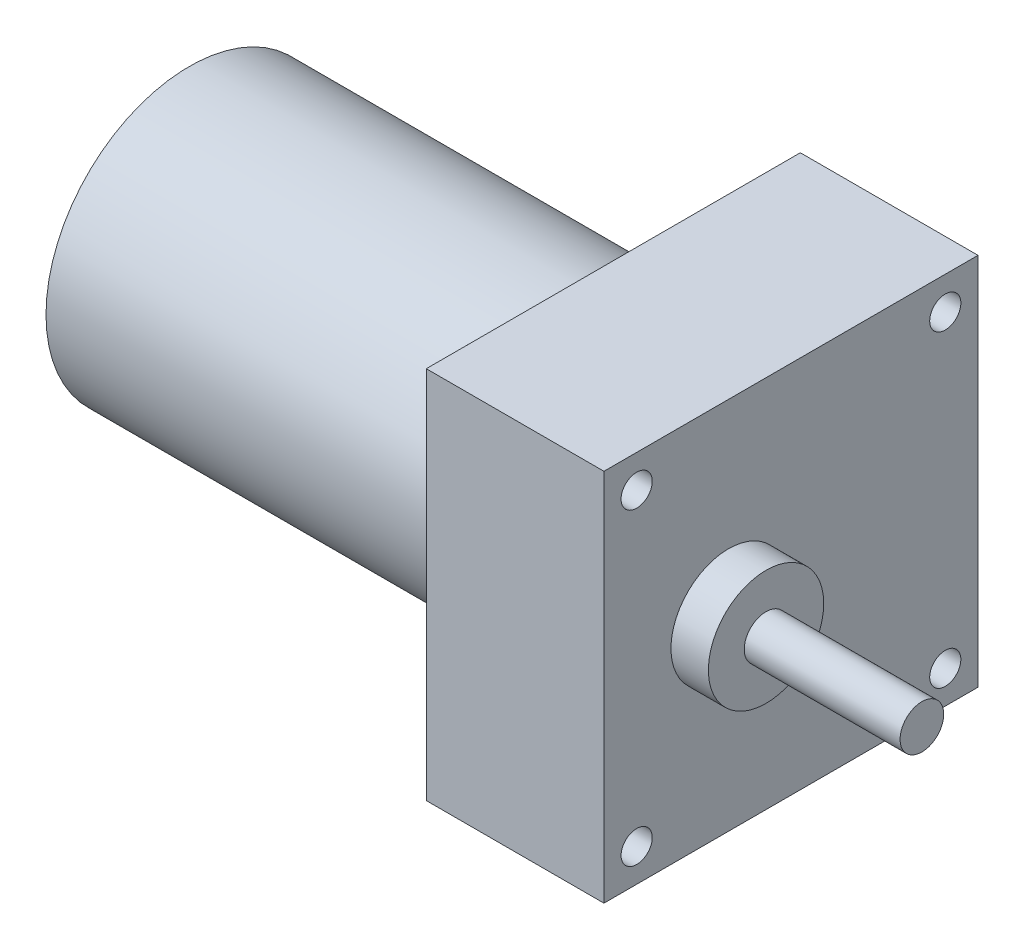
ISO-10303-21;
HEADER;
FILE_DESCRIPTION(('STEP AP214'),'2;1');
FILE_NAME('part.step','',(''),(''),'','','');
FILE_SCHEMA(('AUTOMOTIVE_DESIGN { 1 0 10303 214 1 1 1 1 }'));
ENDSEC;
DATA;
#1=APPLICATION_CONTEXT('core data for automotive mechanical design processes');
#2=APPLICATION_PROTOCOL_DEFINITION('international standard','automotive_design',2000,#1);
#3=PRODUCT_CONTEXT('',#1,'mechanical');
#4=PRODUCT('Part','Part','',(#3));
#5=PRODUCT_RELATED_PRODUCT_CATEGORY('part','',(#4));
#6=PRODUCT_DEFINITION_FORMATION('','',#4);
#7=PRODUCT_DEFINITION_CONTEXT('part definition',#1,'design');
#8=PRODUCT_DEFINITION('design','',#6,#7);
#9=PRODUCT_DEFINITION_SHAPE('','',#8);
#10=(LENGTH_UNIT() NAMED_UNIT(*) SI_UNIT(.MILLI.,.METRE.));
#11=(NAMED_UNIT(*) PLANE_ANGLE_UNIT() SI_UNIT($,.RADIAN.));
#12=(NAMED_UNIT(*) SI_UNIT($,.STERADIAN.) SOLID_ANGLE_UNIT());
#13=UNCERTAINTY_MEASURE_WITH_UNIT(LENGTH_MEASURE(1.E-05),#10,'distance_accuracy_value','');
#14=(GEOMETRIC_REPRESENTATION_CONTEXT(3) GLOBAL_UNCERTAINTY_ASSIGNED_CONTEXT((#13)) GLOBAL_UNIT_ASSIGNED_CONTEXT((#10,
#11,#12)) REPRESENTATION_CONTEXT('',''));
#15=CARTESIAN_POINT('',(0.,0.,0.));
#16=DIRECTION('',(0.,0.,1.));
#17=DIRECTION('',(1.,0.,0.));
#18=AXIS2_PLACEMENT_3D('',#15,#16,#17);
#19=CARTESIAN_POINT('',(59.5,0.,10.));
#20=DIRECTION('',(-1.,0.,0.));
#21=DIRECTION('',(0.,0.,1.));
#22=AXIS2_PLACEMENT_3D('',#19,#20,#21);
#23=CYLINDRICAL_SURFACE('',#22,3.5);
#24=CARTESIAN_POINT('',(59.5,0.,10.));
#25=DIRECTION('',(1.,0.,0.));
#26=DIRECTION('',(0.,0.,-1.));
#27=AXIS2_PLACEMENT_3D('',#24,#25,#26);
#28=CIRCLE('',#27,3.5);
#29=CARTESIAN_POINT('',(59.5,0.,6.5));
#30=VERTEX_POINT('',#29);
#31=EDGE_CURVE('E12',#30,#30,#28,.T.);
#32=ORIENTED_EDGE('',*,*,#31,.F.);
#33=EDGE_LOOP('',(#32));
#34=FACE_BOUND('',#33,.T.);
#35=CARTESIAN_POINT('',(34.5,0.,10.));
#36=DIRECTION('',(1.,0.,0.));
#37=DIRECTION('',(0.,0.,-1.));
#38=AXIS2_PLACEMENT_3D('',#35,#36,#37);
#39=CIRCLE('',#38,3.5);
#40=CARTESIAN_POINT('',(34.5,0.,6.5));
#41=VERTEX_POINT('',#40);
#42=EDGE_CURVE('E59',#41,#41,#39,.T.);
#43=ORIENTED_EDGE('',*,*,#42,.T.);
#44=EDGE_LOOP('',(#43));
#45=FACE_BOUND('',#44,.T.);
#46=ADVANCED_FACE('F54',(#34,#45),#23,.T.);
#47=CARTESIAN_POINT('',(59.5,0.,10.));
#48=DIRECTION('',(1.,0.,0.));
#49=DIRECTION('',(0.,0.,-1.));
#50=AXIS2_PLACEMENT_3D('',#47,#48,#49);
#51=PLANE('',#50);
#52=ORIENTED_EDGE('',*,*,#31,.T.);
#53=EDGE_LOOP('',(#52));
#54=FACE_BOUND('',#53,.T.);
#55=ADVANCED_FACE('F67',(#54),#51,.T.);
#56=CARTESIAN_POINT('',(34.5,0.,10.));
#57=DIRECTION('',(1.,0.,0.));
#58=DIRECTION('',(0.,0.,-1.));
#59=AXIS2_PLACEMENT_3D('',#56,#57,#58);
#60=PLANE('',#59);
#61=ORIENTED_EDGE('',*,*,#42,.F.);
#62=EDGE_LOOP('',(#61));
#63=FACE_BOUND('',#62,.T.);
#64=ADVANCED_FACE('F70',(#63),#60,.F.);
#65=CLOSED_SHELL('',(#46,#55,#64));
#66=MANIFOLD_SOLID_BREP('B2',#65);
#67=CARTESIAN_POINT('',(28.5,0.,-30.));
#68=DIRECTION('',(0.,0.,1.));
#69=DIRECTION('',(1.,0.,0.));
#70=AXIS2_PLACEMENT_3D('',#67,#68,#69);
#71=PLANE('',#70);
#72=DIRECTION('',(0.,1.,0.));
#73=VECTOR('',#72,1.);
#74=CARTESIAN_POINT('',(0.,0.,-30.));
#75=LINE('',#74,#73);
#76=CARTESIAN_POINT('',(0.,-30.,-30.));
#77=VERTEX_POINT('',#76);
#78=CARTESIAN_POINT('',(0.,30.,-30.));
#79=VERTEX_POINT('',#78);
#80=EDGE_CURVE('E180',#77,#79,#75,.T.);
#81=ORIENTED_EDGE('',*,*,#80,.T.);
#82=DIRECTION('',(-1.,0.,0.));
#83=VECTOR('',#82,1.);
#84=CARTESIAN_POINT('',(28.5,30.,-30.));
#85=LINE('',#84,#83);
#86=CARTESIAN_POINT('',(28.5,30.,-30.));
#87=VERTEX_POINT('',#86);
#88=EDGE_CURVE('E160',#87,#79,#85,.T.);
#89=ORIENTED_EDGE('',*,*,#88,.F.);
#90=DIRECTION('',(0.,1.,0.));
#91=VECTOR('',#90,1.);
#92=CARTESIAN_POINT('',(28.5,0.,-30.));
#93=LINE('',#92,#91);
#94=CARTESIAN_POINT('',(28.5,-30.,-30.));
#95=VERTEX_POINT('',#94);
#96=EDGE_CURVE('E146',#95,#87,#93,.T.);
#97=ORIENTED_EDGE('',*,*,#96,.F.);
#98=DIRECTION('',(-1.,0.,0.));
#99=VECTOR('',#98,1.);
#100=CARTESIAN_POINT('',(28.5,-30.,-30.));
#101=LINE('',#100,#99);
#102=EDGE_CURVE('E114',#95,#77,#101,.T.);
#103=ORIENTED_EDGE('',*,*,#102,.T.);
#104=EDGE_LOOP('',(#81,#89,#97,#103));
#105=FACE_BOUND('',#104,.T.);
#106=ADVANCED_FACE('F96',(#105),#71,.F.);
#107=CARTESIAN_POINT('',(28.5,30.,0.));
#108=DIRECTION('',(0.,-1.,0.));
#109=DIRECTION('',(0.,0.,-1.));
#110=AXIS2_PLACEMENT_3D('',#107,#108,#109);
#111=PLANE('',#110);
#112=DIRECTION('',(0.,0.,1.));
#113=VECTOR('',#112,1.);
#114=CARTESIAN_POINT('',(0.,30.,0.));
#115=LINE('',#114,#113);
#116=CARTESIAN_POINT('',(0.,30.,30.));
#117=VERTEX_POINT('',#116);
#118=EDGE_CURVE('E152',#79,#117,#115,.T.);
#119=ORIENTED_EDGE('',*,*,#118,.T.);
#120=DIRECTION('',(-1.,0.,0.));
#121=VECTOR('',#120,1.);
#122=CARTESIAN_POINT('',(28.5,30.,30.));
#123=LINE('',#122,#121);
#124=CARTESIAN_POINT('',(28.5,30.,30.));
#125=VERTEX_POINT('',#124);
#126=EDGE_CURVE('E155',#125,#117,#123,.T.);
#127=ORIENTED_EDGE('',*,*,#126,.F.);
#128=DIRECTION('',(0.,0.,1.));
#129=VECTOR('',#128,1.);
#130=CARTESIAN_POINT('',(28.5,30.,0.));
#131=LINE('',#130,#129);
#132=EDGE_CURVE('E138',#87,#125,#131,.T.);
#133=ORIENTED_EDGE('',*,*,#132,.F.);
#134=ORIENTED_EDGE('',*,*,#88,.T.);
#135=EDGE_LOOP('',(#119,#127,#133,#134));
#136=FACE_BOUND('',#135,.T.);
#137=ADVANCED_FACE('F153',(#136),#111,.F.);
#138=CARTESIAN_POINT('',(28.5,0.,30.));
#139=DIRECTION('',(0.,0.,1.));
#140=DIRECTION('',(1.,0.,0.));
#141=AXIS2_PLACEMENT_3D('',#138,#139,#140);
#142=PLANE('',#141);
#143=DIRECTION('',(0.,1.,0.));
#144=VECTOR('',#143,1.);
#145=CARTESIAN_POINT('',(0.,0.,30.));
#146=LINE('',#145,#144);
#147=CARTESIAN_POINT('',(0.,-30.,30.));
#148=VERTEX_POINT('',#147);
#149=EDGE_CURVE('E182',#148,#117,#146,.T.);
#150=ORIENTED_EDGE('',*,*,#149,.F.);
#151=DIRECTION('',(-1.,0.,0.));
#152=VECTOR('',#151,1.);
#153=CARTESIAN_POINT('',(28.5,-30.,30.));
#154=LINE('',#153,#152);
#155=CARTESIAN_POINT('',(28.5,-30.,30.));
#156=VERTEX_POINT('',#155);
#157=EDGE_CURVE('E130',#156,#148,#154,.T.);
#158=ORIENTED_EDGE('',*,*,#157,.F.);
#159=DIRECTION('',(0.,1.,0.));
#160=VECTOR('',#159,1.);
#161=CARTESIAN_POINT('',(28.5,0.,30.));
#162=LINE('',#161,#160);
#163=EDGE_CURVE('E150',#156,#125,#162,.T.);
#164=ORIENTED_EDGE('',*,*,#163,.T.);
#165=ORIENTED_EDGE('',*,*,#126,.T.);
#166=EDGE_LOOP('',(#150,#158,#164,#165));
#167=FACE_BOUND('',#166,.T.);
#168=ADVANCED_FACE('F157',(#167),#142,.T.);
#169=CARTESIAN_POINT('',(28.5,24.75,-24.75));
#170=DIRECTION('',(-1.,0.,0.));
#171=DIRECTION('',(0.,0.,1.));
#172=AXIS2_PLACEMENT_3D('',#169,#170,#171);
#173=CYLINDRICAL_SURFACE('',#172,2.5);
#174=CARTESIAN_POINT('',(28.5,24.75,-24.75));
#175=DIRECTION('',(1.,0.,0.));
#176=DIRECTION('',(0.,0.,-1.));
#177=AXIS2_PLACEMENT_3D('',#174,#175,#176);
#178=CIRCLE('',#177,2.5);
#179=CARTESIAN_POINT('',(28.5,24.75,-22.25));
#180=VERTEX_POINT('',#179);
#181=EDGE_CURVE('E165',#180,#180,#178,.T.);
#182=CARTESIAN_POINT('',(0.,24.75,-24.75));
#183=DIRECTION('',(1.,0.,0.));
#184=DIRECTION('',(0.,0.,-1.));
#185=AXIS2_PLACEMENT_3D('',#182,#183,#184);
#186=CIRCLE('',#185,2.5);
#187=CARTESIAN_POINT('',(0.,24.75,-22.25));
#188=VERTEX_POINT('',#187);
#189=EDGE_CURVE('E186',#188,#188,#186,.T.);
#190=CARTESIAN_POINT('',(28.5,24.75,-22.25));
#191=CARTESIAN_POINT('',(28.203125,24.75,-22.25));
#192=CARTESIAN_POINT('',(27.90625,24.75,-22.25));
#193=CARTESIAN_POINT('',(27.3125,24.75,-22.25));
#194=CARTESIAN_POINT('',(27.015625,24.75,-22.25));
#195=CARTESIAN_POINT('',(26.421875,24.75,-22.25));
#196=CARTESIAN_POINT('',(26.125,24.75,-22.25));
#197=CARTESIAN_POINT('',(25.53125,24.75,-22.25));
#198=CARTESIAN_POINT('',(25.234375,24.75,-22.25));
#199=CARTESIAN_POINT('',(24.640625,24.75,-22.25));
#200=CARTESIAN_POINT('',(24.34375,24.75,-22.25));
#201=CARTESIAN_POINT('',(23.75,24.75,-22.25));
#202=CARTESIAN_POINT('',(23.453125,24.75,-22.25));
#203=CARTESIAN_POINT('',(22.859375,24.75,-22.25));
#204=CARTESIAN_POINT('',(22.5625,24.75,-22.25));
#205=CARTESIAN_POINT('',(21.96875,24.75,-22.25));
#206=CARTESIAN_POINT('',(21.671875,24.75,-22.25));
#207=CARTESIAN_POINT('',(21.078125,24.75,-22.25));
#208=CARTESIAN_POINT('',(20.78125,24.75,-22.25));
#209=CARTESIAN_POINT('',(20.1875,24.75,-22.25));
#210=CARTESIAN_POINT('',(19.890625,24.75,-22.25));
#211=CARTESIAN_POINT('',(19.296875,24.75,-22.25));
#212=CARTESIAN_POINT('',(19.,24.75,-22.25));
#213=CARTESIAN_POINT('',(18.40625,24.75,-22.25));
#214=CARTESIAN_POINT('',(18.109375,24.75,-22.25));
#215=CARTESIAN_POINT('',(17.515625,24.75,-22.25));
#216=CARTESIAN_POINT('',(17.21875,24.75,-22.25));
#217=CARTESIAN_POINT('',(16.625,24.75,-22.25));
#218=CARTESIAN_POINT('',(16.328125,24.75,-22.25));
#219=CARTESIAN_POINT('',(15.734375,24.75,-22.25));
#220=CARTESIAN_POINT('',(15.4375,24.75,-22.25));
#221=CARTESIAN_POINT('',(14.84375,24.75,-22.25));
#222=CARTESIAN_POINT('',(14.546875,24.75,-22.25));
#223=CARTESIAN_POINT('',(13.953125,24.75,-22.25));
#224=CARTESIAN_POINT('',(13.65625,24.75,-22.25));
#225=CARTESIAN_POINT('',(13.0625,24.75,-22.25));
#226=CARTESIAN_POINT('',(12.765625,24.75,-22.25));
#227=CARTESIAN_POINT('',(12.171875,24.75,-22.25));
#228=CARTESIAN_POINT('',(11.875,24.75,-22.25));
#229=CARTESIAN_POINT('',(11.28125,24.75,-22.25));
#230=CARTESIAN_POINT('',(10.984375,24.75,-22.25));
#231=CARTESIAN_POINT('',(10.390625,24.75,-22.25));
#232=CARTESIAN_POINT('',(10.09375,24.75,-22.25));
#233=CARTESIAN_POINT('',(9.5,24.75,-22.25));
#234=CARTESIAN_POINT('',(9.203125,24.75,-22.25));
#235=CARTESIAN_POINT('',(8.609375,24.75,-22.25));
#236=CARTESIAN_POINT('',(8.3125,24.75,-22.25));
#237=CARTESIAN_POINT('',(7.71875,24.75,-22.25));
#238=CARTESIAN_POINT('',(7.421875,24.75,-22.25));
#239=CARTESIAN_POINT('',(6.828125,24.75,-22.25));
#240=CARTESIAN_POINT('',(6.53125,24.75,-22.25));
#241=CARTESIAN_POINT('',(5.9375,24.75,-22.25));
#242=CARTESIAN_POINT('',(5.640625,24.75,-22.25));
#243=CARTESIAN_POINT('',(5.046875,24.75,-22.25));
#244=CARTESIAN_POINT('',(4.75,24.75,-22.25));
#245=CARTESIAN_POINT('',(4.15625,24.75,-22.25));
#246=CARTESIAN_POINT('',(3.859375,24.75,-22.25));
#247=CARTESIAN_POINT('',(3.265625,24.75,-22.25));
#248=CARTESIAN_POINT('',(2.96875,24.75,-22.25));
#249=CARTESIAN_POINT('',(2.375,24.75,-22.25));
#250=CARTESIAN_POINT('',(2.078125,24.75,-22.25));
#251=CARTESIAN_POINT('',(1.484375,24.75,-22.25));
#252=CARTESIAN_POINT('',(1.1875,24.75,-22.25));
#253=CARTESIAN_POINT('',(0.593749999999999,24.75,-22.25));
#254=CARTESIAN_POINT('',(0.296875,24.75,-22.25));
#255=CARTESIAN_POINT('',(0.,24.75,-22.25));
#256=B_SPLINE_CURVE_WITH_KNOTS('',3,(#190,#191,#192,#193,#194,#195,#196,#197,#198,#199,#200,
#201,#202,#203,#204,#205,#206,#207,#208,#209,#210,#211,#212,#213,#214,#215,#216,#217,#218,#219,
#220,#221,#222,#223,#224,#225,#226,#227,#228,#229,#230,#231,#232,#233,#234,#235,#236,#237,#238,
#239,#240,#241,#242,#243,#244,#245,#246,#247,#248,#249,#250,#251,#252,#253,#254,#255),
.UNSPECIFIED.,.F.,.F.,(4,2,2,2,2,2,2,2,2,2,2,2,2,2,2,2,2,2,2,2,2,2,2,2,2,2,2,2,2,2,2,2,4),(0.,
0.890624999999999,1.78125,2.671875,3.5625,4.453125,5.34375,6.234375,7.125,8.015625,8.90625,
9.796875,10.6875,11.578125,12.46875,13.359375,14.25,15.140625,16.03125,16.921875,17.8125,
18.703125,19.59375,20.484375,21.375,22.265625,23.15625,24.046875,24.9375,25.828125,26.71875,
27.609375,28.5),.UNSPECIFIED.);
#257=EDGE_CURVE('BSEAM240',#180,#188,#256,.T.);
#258=ORIENTED_EDGE('',*,*,#181,.T.);
#259=ORIENTED_EDGE('',*,*,#189,.F.);
#260=ORIENTED_EDGE('',*,*,#257,.T.);
#261=ORIENTED_EDGE('',*,*,#257,.F.);
#262=EDGE_LOOP('',(#258,#260,#259,#261));
#263=FACE_BOUND('',#262,.T.);
#264=ADVANCED_FACE('F240',(#263),#173,.F.);
#265=CARTESIAN_POINT('',(28.5,-30.,0.));
#266=DIRECTION('',(0.,-1.,0.));
#267=DIRECTION('',(0.,0.,-1.));
#268=AXIS2_PLACEMENT_3D('',#265,#266,#267);
#269=PLANE('',#268);
#270=DIRECTION('',(0.,0.,1.));
#271=VECTOR('',#270,1.);
#272=CARTESIAN_POINT('',(0.,-30.,0.));
#273=LINE('',#272,#271);
#274=EDGE_CURVE('E181',#77,#148,#273,.T.);
#275=ORIENTED_EDGE('',*,*,#274,.F.);
#276=ORIENTED_EDGE('',*,*,#102,.F.);
#277=DIRECTION('',(0.,0.,1.));
#278=VECTOR('',#277,1.);
#279=CARTESIAN_POINT('',(28.5,-30.,0.));
#280=LINE('',#279,#278);
#281=EDGE_CURVE('E159',#95,#156,#280,.T.);
#282=ORIENTED_EDGE('',*,*,#281,.T.);
#283=ORIENTED_EDGE('',*,*,#157,.T.);
#284=EDGE_LOOP('',(#275,#276,#282,#283));
#285=FACE_BOUND('',#284,.T.);
#286=ADVANCED_FACE('F229',(#285),#269,.T.);
#287=CARTESIAN_POINT('',(28.5,-24.75,24.75));
#288=DIRECTION('',(-1.,0.,0.));
#289=DIRECTION('',(0.,0.,1.));
#290=AXIS2_PLACEMENT_3D('',#287,#288,#289);
#291=CYLINDRICAL_SURFACE('',#290,2.5);
#292=CARTESIAN_POINT('',(28.5,-24.75,24.75));
#293=DIRECTION('',(1.,0.,0.));
#294=DIRECTION('',(0.,0.,-1.));
#295=AXIS2_PLACEMENT_3D('',#292,#293,#294);
#296=CIRCLE('',#295,2.5);
#297=CARTESIAN_POINT('',(28.5,-24.75,27.25));
#298=VERTEX_POINT('',#297);
#299=EDGE_CURVE('E245',#298,#298,#296,.T.);
#300=CARTESIAN_POINT('',(0.,-24.75,24.75));
#301=DIRECTION('',(1.,0.,0.));
#302=DIRECTION('',(0.,0.,-1.));
#303=AXIS2_PLACEMENT_3D('',#300,#301,#302);
#304=CIRCLE('',#303,2.5);
#305=CARTESIAN_POINT('',(0.,-24.75,27.25));
#306=VERTEX_POINT('',#305);
#307=EDGE_CURVE('E173',#306,#306,#304,.T.);
#308=CARTESIAN_POINT('',(28.5,-24.75,27.25));
#309=CARTESIAN_POINT('',(28.203125,-24.75,27.25));
#310=CARTESIAN_POINT('',(27.90625,-24.75,27.25));
#311=CARTESIAN_POINT('',(27.3125,-24.75,27.25));
#312=CARTESIAN_POINT('',(27.015625,-24.75,27.25));
#313=CARTESIAN_POINT('',(26.421875,-24.75,27.25));
#314=CARTESIAN_POINT('',(26.125,-24.75,27.25));
#315=CARTESIAN_POINT('',(25.53125,-24.75,27.25));
#316=CARTESIAN_POINT('',(25.234375,-24.75,27.25));
#317=CARTESIAN_POINT('',(24.640625,-24.75,27.25));
#318=CARTESIAN_POINT('',(24.34375,-24.75,27.25));
#319=CARTESIAN_POINT('',(23.75,-24.75,27.25));
#320=CARTESIAN_POINT('',(23.453125,-24.75,27.25));
#321=CARTESIAN_POINT('',(22.859375,-24.75,27.25));
#322=CARTESIAN_POINT('',(22.5625,-24.75,27.25));
#323=CARTESIAN_POINT('',(21.96875,-24.75,27.25));
#324=CARTESIAN_POINT('',(21.671875,-24.75,27.25));
#325=CARTESIAN_POINT('',(21.078125,-24.75,27.25));
#326=CARTESIAN_POINT('',(20.78125,-24.75,27.25));
#327=CARTESIAN_POINT('',(20.1875,-24.75,27.25));
#328=CARTESIAN_POINT('',(19.890625,-24.75,27.25));
#329=CARTESIAN_POINT('',(19.296875,-24.75,27.25));
#330=CARTESIAN_POINT('',(19.,-24.75,27.25));
#331=CARTESIAN_POINT('',(18.40625,-24.75,27.25));
#332=CARTESIAN_POINT('',(18.109375,-24.75,27.25));
#333=CARTESIAN_POINT('',(17.515625,-24.75,27.25));
#334=CARTESIAN_POINT('',(17.21875,-24.75,27.25));
#335=CARTESIAN_POINT('',(16.625,-24.75,27.25));
#336=CARTESIAN_POINT('',(16.328125,-24.75,27.25));
#337=CARTESIAN_POINT('',(15.734375,-24.75,27.25));
#338=CARTESIAN_POINT('',(15.4375,-24.75,27.25));
#339=CARTESIAN_POINT('',(14.84375,-24.75,27.25));
#340=CARTESIAN_POINT('',(14.546875,-24.75,27.25));
#341=CARTESIAN_POINT('',(13.953125,-24.75,27.25));
#342=CARTESIAN_POINT('',(13.65625,-24.75,27.25));
#343=CARTESIAN_POINT('',(13.0625,-24.75,27.25));
#344=CARTESIAN_POINT('',(12.765625,-24.75,27.25));
#345=CARTESIAN_POINT('',(12.171875,-24.75,27.25));
#346=CARTESIAN_POINT('',(11.875,-24.75,27.25));
#347=CARTESIAN_POINT('',(11.28125,-24.75,27.25));
#348=CARTESIAN_POINT('',(10.984375,-24.75,27.25));
#349=CARTESIAN_POINT('',(10.390625,-24.75,27.25));
#350=CARTESIAN_POINT('',(10.09375,-24.75,27.25));
#351=CARTESIAN_POINT('',(9.5,-24.75,27.25));
#352=CARTESIAN_POINT('',(9.203125,-24.75,27.25));
#353=CARTESIAN_POINT('',(8.609375,-24.75,27.25));
#354=CARTESIAN_POINT('',(8.3125,-24.75,27.25));
#355=CARTESIAN_POINT('',(7.71875,-24.75,27.25));
#356=CARTESIAN_POINT('',(7.421875,-24.75,27.25));
#357=CARTESIAN_POINT('',(6.828125,-24.75,27.25));
#358=CARTESIAN_POINT('',(6.53125,-24.75,27.25));
#359=CARTESIAN_POINT('',(5.9375,-24.75,27.25));
#360=CARTESIAN_POINT('',(5.640625,-24.75,27.25));
#361=CARTESIAN_POINT('',(5.046875,-24.75,27.25));
#362=CARTESIAN_POINT('',(4.75,-24.75,27.25));
#363=CARTESIAN_POINT('',(4.15625,-24.75,27.25));
#364=CARTESIAN_POINT('',(3.859375,-24.75,27.25));
#365=CARTESIAN_POINT('',(3.265625,-24.75,27.25));
#366=CARTESIAN_POINT('',(2.96875,-24.75,27.25));
#367=CARTESIAN_POINT('',(2.375,-24.75,27.25));
#368=CARTESIAN_POINT('',(2.078125,-24.75,27.25));
#369=CARTESIAN_POINT('',(1.484375,-24.75,27.25));
#370=CARTESIAN_POINT('',(1.1875,-24.75,27.25));
#371=CARTESIAN_POINT('',(0.593749999999999,-24.75,27.25));
#372=CARTESIAN_POINT('',(0.296875,-24.75,27.25));
#373=CARTESIAN_POINT('',(0.,-24.75,27.25));
#374=B_SPLINE_CURVE_WITH_KNOTS('',3,(#308,#309,#310,#311,#312,#313,#314,#315,#316,#317,#318,
#319,#320,#321,#322,#323,#324,#325,#326,#327,#328,#329,#330,#331,#332,#333,#334,#335,#336,#337,
#338,#339,#340,#341,#342,#343,#344,#345,#346,#347,#348,#349,#350,#351,#352,#353,#354,#355,#356,
#357,#358,#359,#360,#361,#362,#363,#364,#365,#366,#367,#368,#369,#370,#371,#372,#373),
.UNSPECIFIED.,.F.,.F.,(4,2,2,2,2,2,2,2,2,2,2,2,2,2,2,2,2,2,2,2,2,2,2,2,2,2,2,2,2,2,2,2,4),(0.,
0.890624999999999,1.78125,2.671875,3.5625,4.453125,5.34375,6.234375,7.125,8.015625,8.90625,
9.796875,10.6875,11.578125,12.46875,13.359375,14.25,15.140625,16.03125,16.921875,17.8125,
18.703125,19.59375,20.484375,21.375,22.265625,23.15625,24.046875,24.9375,25.828125,26.71875,
27.609375,28.5),.UNSPECIFIED.);
#375=EDGE_CURVE('BSEAM227',#298,#306,#374,.T.);
#376=ORIENTED_EDGE('',*,*,#299,.T.);
#377=ORIENTED_EDGE('',*,*,#307,.F.);
#378=ORIENTED_EDGE('',*,*,#375,.T.);
#379=ORIENTED_EDGE('',*,*,#375,.F.);
#380=EDGE_LOOP('',(#376,#378,#377,#379));
#381=FACE_BOUND('',#380,.T.);
#382=ADVANCED_FACE('F227',(#381),#291,.F.);
#383=CARTESIAN_POINT('',(28.5,24.75,24.75));
#384=DIRECTION('',(-1.,0.,0.));
#385=DIRECTION('',(0.,0.,1.));
#386=AXIS2_PLACEMENT_3D('',#383,#384,#385);
#387=CYLINDRICAL_SURFACE('',#386,2.5);
#388=CARTESIAN_POINT('',(28.5,24.75,24.75));
#389=DIRECTION('',(1.,0.,0.));
#390=DIRECTION('',(0.,0.,-1.));
#391=AXIS2_PLACEMENT_3D('',#388,#389,#390);
#392=CIRCLE('',#391,2.5);
#393=CARTESIAN_POINT('',(28.5,24.75,27.25));
#394=VERTEX_POINT('',#393);
#395=EDGE_CURVE('E191',#394,#394,#392,.F.);
#396=CARTESIAN_POINT('',(0.,24.75,24.75));
#397=DIRECTION('',(1.,0.,0.));
#398=DIRECTION('',(0.,0.,-1.));
#399=AXIS2_PLACEMENT_3D('',#396,#397,#398);
#400=CIRCLE('',#399,2.5);
#401=CARTESIAN_POINT('',(0.,24.75,27.25));
#402=VERTEX_POINT('',#401);
#403=EDGE_CURVE('E171',#402,#402,#400,.F.);
#404=CARTESIAN_POINT('',(28.5,24.75,27.25));
#405=CARTESIAN_POINT('',(28.203125,24.75,27.25));
#406=CARTESIAN_POINT('',(27.90625,24.75,27.25));
#407=CARTESIAN_POINT('',(27.3125,24.75,27.25));
#408=CARTESIAN_POINT('',(27.015625,24.75,27.25));
#409=CARTESIAN_POINT('',(26.421875,24.75,27.25));
#410=CARTESIAN_POINT('',(26.125,24.75,27.25));
#411=CARTESIAN_POINT('',(25.53125,24.75,27.25));
#412=CARTESIAN_POINT('',(25.234375,24.75,27.25));
#413=CARTESIAN_POINT('',(24.640625,24.75,27.25));
#414=CARTESIAN_POINT('',(24.34375,24.75,27.25));
#415=CARTESIAN_POINT('',(23.75,24.75,27.25));
#416=CARTESIAN_POINT('',(23.453125,24.75,27.25));
#417=CARTESIAN_POINT('',(22.859375,24.75,27.25));
#418=CARTESIAN_POINT('',(22.5625,24.75,27.25));
#419=CARTESIAN_POINT('',(21.96875,24.75,27.25));
#420=CARTESIAN_POINT('',(21.671875,24.75,27.25));
#421=CARTESIAN_POINT('',(21.078125,24.75,27.25));
#422=CARTESIAN_POINT('',(20.78125,24.75,27.25));
#423=CARTESIAN_POINT('',(20.1875,24.75,27.25));
#424=CARTESIAN_POINT('',(19.890625,24.75,27.25));
#425=CARTESIAN_POINT('',(19.296875,24.75,27.25));
#426=CARTESIAN_POINT('',(19.,24.75,27.25));
#427=CARTESIAN_POINT('',(18.40625,24.75,27.25));
#428=CARTESIAN_POINT('',(18.109375,24.75,27.25));
#429=CARTESIAN_POINT('',(17.515625,24.75,27.25));
#430=CARTESIAN_POINT('',(17.21875,24.75,27.25));
#431=CARTESIAN_POINT('',(16.625,24.75,27.25));
#432=CARTESIAN_POINT('',(16.328125,24.75,27.25));
#433=CARTESIAN_POINT('',(15.734375,24.75,27.25));
#434=CARTESIAN_POINT('',(15.4375,24.75,27.25));
#435=CARTESIAN_POINT('',(14.84375,24.75,27.25));
#436=CARTESIAN_POINT('',(14.546875,24.75,27.25));
#437=CARTESIAN_POINT('',(13.953125,24.75,27.25));
#438=CARTESIAN_POINT('',(13.65625,24.75,27.25));
#439=CARTESIAN_POINT('',(13.0625,24.75,27.25));
#440=CARTESIAN_POINT('',(12.765625,24.75,27.25));
#441=CARTESIAN_POINT('',(12.171875,24.75,27.25));
#442=CARTESIAN_POINT('',(11.875,24.75,27.25));
#443=CARTESIAN_POINT('',(11.28125,24.75,27.25));
#444=CARTESIAN_POINT('',(10.984375,24.75,27.25));
#445=CARTESIAN_POINT('',(10.390625,24.75,27.25));
#446=CARTESIAN_POINT('',(10.09375,24.75,27.25));
#447=CARTESIAN_POINT('',(9.5,24.75,27.25));
#448=CARTESIAN_POINT('',(9.203125,24.75,27.25));
#449=CARTESIAN_POINT('',(8.609375,24.75,27.25));
#450=CARTESIAN_POINT('',(8.3125,24.75,27.25));
#451=CARTESIAN_POINT('',(7.71875,24.75,27.25));
#452=CARTESIAN_POINT('',(7.421875,24.75,27.25));
#453=CARTESIAN_POINT('',(6.828125,24.75,27.25));
#454=CARTESIAN_POINT('',(6.53125,24.75,27.25));
#455=CARTESIAN_POINT('',(5.9375,24.75,27.25));
#456=CARTESIAN_POINT('',(5.640625,24.75,27.25));
#457=CARTESIAN_POINT('',(5.046875,24.75,27.25));
#458=CARTESIAN_POINT('',(4.75,24.75,27.25));
#459=CARTESIAN_POINT('',(4.15625,24.75,27.25));
#460=CARTESIAN_POINT('',(3.859375,24.75,27.25));
#461=CARTESIAN_POINT('',(3.265625,24.75,27.25));
#462=CARTESIAN_POINT('',(2.96875,24.75,27.25));
#463=CARTESIAN_POINT('',(2.375,24.75,27.25));
#464=CARTESIAN_POINT('',(2.078125,24.75,27.25));
#465=CARTESIAN_POINT('',(1.484375,24.75,27.25));
#466=CARTESIAN_POINT('',(1.1875,24.75,27.25));
#467=CARTESIAN_POINT('',(0.593749999999999,24.75,27.25));
#468=CARTESIAN_POINT('',(0.296875,24.75,27.25));
#469=CARTESIAN_POINT('',(0.,24.75,27.25));
#470=B_SPLINE_CURVE_WITH_KNOTS('',3,(#404,#405,#406,#407,#408,#409,#410,#411,#412,#413,#414,
#415,#416,#417,#418,#419,#420,#421,#422,#423,#424,#425,#426,#427,#428,#429,#430,#431,#432,#433,
#434,#435,#436,#437,#438,#439,#440,#441,#442,#443,#444,#445,#446,#447,#448,#449,#450,#451,#452,
#453,#454,#455,#456,#457,#458,#459,#460,#461,#462,#463,#464,#465,#466,#467,#468,#469),
.UNSPECIFIED.,.F.,.F.,(4,2,2,2,2,2,2,2,2,2,2,2,2,2,2,2,2,2,2,2,2,2,2,2,2,2,2,2,2,2,2,2,4),(0.,
0.890624999999999,1.78125,2.671875,3.5625,4.453125,5.34375,6.234375,7.125,8.015625,8.90625,
9.796875,10.6875,11.578125,12.46875,13.359375,14.25,15.140625,16.03125,16.921875,17.8125,
18.703125,19.59375,20.484375,21.375,22.265625,23.15625,24.046875,24.9375,25.828125,26.71875,
27.609375,28.5),.UNSPECIFIED.);
#471=EDGE_CURVE('BSEAM98',#394,#402,#470,.T.);
#472=ORIENTED_EDGE('',*,*,#395,.F.);
#473=ORIENTED_EDGE('',*,*,#403,.T.);
#474=ORIENTED_EDGE('',*,*,#471,.T.);
#475=ORIENTED_EDGE('',*,*,#471,.F.);
#476=EDGE_LOOP('',(#472,#474,#473,#475));
#477=FACE_BOUND('',#476,.T.);
#478=ADVANCED_FACE('F98',(#477),#387,.F.);
#479=CARTESIAN_POINT('',(28.5,-24.75,-24.75));
#480=DIRECTION('',(-1.,0.,0.));
#481=DIRECTION('',(0.,0.,1.));
#482=AXIS2_PLACEMENT_3D('',#479,#480,#481);
#483=CYLINDRICAL_SURFACE('',#482,2.5);
#484=CARTESIAN_POINT('',(28.5,-24.75,-24.75));
#485=DIRECTION('',(1.,0.,0.));
#486=DIRECTION('',(0.,0.,-1.));
#487=AXIS2_PLACEMENT_3D('',#484,#485,#486);
#488=CIRCLE('',#487,2.5);
#489=CARTESIAN_POINT('',(28.5,-24.75,-22.25));
#490=VERTEX_POINT('',#489);
#491=EDGE_CURVE('E169',#490,#490,#488,.F.);
#492=CARTESIAN_POINT('',(0.,-24.75,-24.75));
#493=DIRECTION('',(1.,0.,0.));
#494=DIRECTION('',(0.,0.,-1.));
#495=AXIS2_PLACEMENT_3D('',#492,#493,#494);
#496=CIRCLE('',#495,2.5);
#497=CARTESIAN_POINT('',(0.,-24.75,-22.25));
#498=VERTEX_POINT('',#497);
#499=EDGE_CURVE('E188',#498,#498,#496,.F.);
#500=CARTESIAN_POINT('',(28.5,-24.75,-22.25));
#501=CARTESIAN_POINT('',(28.203125,-24.75,-22.25));
#502=CARTESIAN_POINT('',(27.90625,-24.75,-22.25));
#503=CARTESIAN_POINT('',(27.3125,-24.75,-22.25));
#504=CARTESIAN_POINT('',(27.015625,-24.75,-22.25));
#505=CARTESIAN_POINT('',(26.421875,-24.75,-22.25));
#506=CARTESIAN_POINT('',(26.125,-24.75,-22.25));
#507=CARTESIAN_POINT('',(25.53125,-24.75,-22.25));
#508=CARTESIAN_POINT('',(25.234375,-24.75,-22.25));
#509=CARTESIAN_POINT('',(24.640625,-24.75,-22.25));
#510=CARTESIAN_POINT('',(24.34375,-24.75,-22.25));
#511=CARTESIAN_POINT('',(23.75,-24.75,-22.25));
#512=CARTESIAN_POINT('',(23.453125,-24.75,-22.25));
#513=CARTESIAN_POINT('',(22.859375,-24.75,-22.25));
#514=CARTESIAN_POINT('',(22.5625,-24.75,-22.25));
#515=CARTESIAN_POINT('',(21.96875,-24.75,-22.25));
#516=CARTESIAN_POINT('',(21.671875,-24.75,-22.25));
#517=CARTESIAN_POINT('',(21.078125,-24.75,-22.25));
#518=CARTESIAN_POINT('',(20.78125,-24.75,-22.25));
#519=CARTESIAN_POINT('',(20.1875,-24.75,-22.25));
#520=CARTESIAN_POINT('',(19.890625,-24.75,-22.25));
#521=CARTESIAN_POINT('',(19.296875,-24.75,-22.25));
#522=CARTESIAN_POINT('',(19.,-24.75,-22.25));
#523=CARTESIAN_POINT('',(18.40625,-24.75,-22.25));
#524=CARTESIAN_POINT('',(18.109375,-24.75,-22.25));
#525=CARTESIAN_POINT('',(17.515625,-24.75,-22.25));
#526=CARTESIAN_POINT('',(17.21875,-24.75,-22.25));
#527=CARTESIAN_POINT('',(16.625,-24.75,-22.25));
#528=CARTESIAN_POINT('',(16.328125,-24.75,-22.25));
#529=CARTESIAN_POINT('',(15.734375,-24.75,-22.25));
#530=CARTESIAN_POINT('',(15.4375,-24.75,-22.25));
#531=CARTESIAN_POINT('',(14.84375,-24.75,-22.25));
#532=CARTESIAN_POINT('',(14.546875,-24.75,-22.25));
#533=CARTESIAN_POINT('',(13.953125,-24.75,-22.25));
#534=CARTESIAN_POINT('',(13.65625,-24.75,-22.25));
#535=CARTESIAN_POINT('',(13.0625,-24.75,-22.25));
#536=CARTESIAN_POINT('',(12.765625,-24.75,-22.25));
#537=CARTESIAN_POINT('',(12.171875,-24.75,-22.25));
#538=CARTESIAN_POINT('',(11.875,-24.75,-22.25));
#539=CARTESIAN_POINT('',(11.28125,-24.75,-22.25));
#540=CARTESIAN_POINT('',(10.984375,-24.75,-22.25));
#541=CARTESIAN_POINT('',(10.390625,-24.75,-22.25));
#542=CARTESIAN_POINT('',(10.09375,-24.75,-22.25));
#543=CARTESIAN_POINT('',(9.5,-24.75,-22.25));
#544=CARTESIAN_POINT('',(9.203125,-24.75,-22.25));
#545=CARTESIAN_POINT('',(8.609375,-24.75,-22.25));
#546=CARTESIAN_POINT('',(8.3125,-24.75,-22.25));
#547=CARTESIAN_POINT('',(7.71875,-24.75,-22.25));
#548=CARTESIAN_POINT('',(7.421875,-24.75,-22.25));
#549=CARTESIAN_POINT('',(6.828125,-24.75,-22.25));
#550=CARTESIAN_POINT('',(6.53125,-24.75,-22.25));
#551=CARTESIAN_POINT('',(5.9375,-24.75,-22.25));
#552=CARTESIAN_POINT('',(5.640625,-24.75,-22.25));
#553=CARTESIAN_POINT('',(5.046875,-24.75,-22.25));
#554=CARTESIAN_POINT('',(4.75,-24.75,-22.25));
#555=CARTESIAN_POINT('',(4.15625,-24.75,-22.25));
#556=CARTESIAN_POINT('',(3.859375,-24.75,-22.25));
#557=CARTESIAN_POINT('',(3.265625,-24.75,-22.25));
#558=CARTESIAN_POINT('',(2.96875,-24.75,-22.25));
#559=CARTESIAN_POINT('',(2.375,-24.75,-22.25));
#560=CARTESIAN_POINT('',(2.078125,-24.75,-22.25));
#561=CARTESIAN_POINT('',(1.484375,-24.75,-22.25));
#562=CARTESIAN_POINT('',(1.1875,-24.75,-22.25));
#563=CARTESIAN_POINT('',(0.593749999999999,-24.75,-22.25));
#564=CARTESIAN_POINT('',(0.296875,-24.75,-22.25));
#565=CARTESIAN_POINT('',(0.,-24.75,-22.25));
#566=B_SPLINE_CURVE_WITH_KNOTS('',3,(#500,#501,#502,#503,#504,#505,#506,#507,#508,#509,#510,
#511,#512,#513,#514,#515,#516,#517,#518,#519,#520,#521,#522,#523,#524,#525,#526,#527,#528,#529,
#530,#531,#532,#533,#534,#535,#536,#537,#538,#539,#540,#541,#542,#543,#544,#545,#546,#547,#548,
#549,#550,#551,#552,#553,#554,#555,#556,#557,#558,#559,#560,#561,#562,#563,#564,#565),
.UNSPECIFIED.,.F.,.F.,(4,2,2,2,2,2,2,2,2,2,2,2,2,2,2,2,2,2,2,2,2,2,2,2,2,2,2,2,2,2,2,2,4),(0.,
0.890624999999999,1.78125,2.671875,3.5625,4.453125,5.34375,6.234375,7.125,8.015625,8.90625,
9.796875,10.6875,11.578125,12.46875,13.359375,14.25,15.140625,16.03125,16.921875,17.8125,
18.703125,19.59375,20.484375,21.375,22.265625,23.15625,24.046875,24.9375,25.828125,26.71875,
27.609375,28.5),.UNSPECIFIED.);
#567=EDGE_CURVE('BSEAM218',#490,#498,#566,.T.);
#568=ORIENTED_EDGE('',*,*,#491,.F.);
#569=ORIENTED_EDGE('',*,*,#499,.T.);
#570=ORIENTED_EDGE('',*,*,#567,.T.);
#571=ORIENTED_EDGE('',*,*,#567,.F.);
#572=EDGE_LOOP('',(#568,#570,#569,#571));
#573=FACE_BOUND('',#572,.T.);
#574=ADVANCED_FACE('F218',(#573),#483,.F.);
#575=CARTESIAN_POINT('',(28.5,0.,0.));
#576=DIRECTION('',(1.,0.,0.));
#577=DIRECTION('',(0.,0.,-1.));
#578=AXIS2_PLACEMENT_3D('',#575,#576,#577);
#579=PLANE('',#578);
#580=CARTESIAN_POINT('',(28.5,0.,10.));
#581=DIRECTION('',(1.,0.,0.));
#582=DIRECTION('',(0.,0.,-1.));
#583=AXIS2_PLACEMENT_3D('',#580,#581,#582);
#584=CIRCLE('',#583,9.25);
#585=CARTESIAN_POINT('',(28.5,0.,0.750000000000001));
#586=VERTEX_POINT('',#585);
#587=EDGE_CURVE('E360',#586,#586,#584,.T.);
#588=ORIENTED_EDGE('',*,*,#587,.F.);
#589=EDGE_LOOP('',(#588));
#590=FACE_BOUND('',#589,.T.);
#591=ORIENTED_EDGE('',*,*,#395,.T.);
#592=EDGE_LOOP('',(#591));
#593=FACE_BOUND('',#592,.T.);
#594=ORIENTED_EDGE('',*,*,#299,.F.);
#595=EDGE_LOOP('',(#594));
#596=FACE_BOUND('',#595,.T.);
#597=ORIENTED_EDGE('',*,*,#96,.T.);
#598=ORIENTED_EDGE('',*,*,#132,.T.);
#599=ORIENTED_EDGE('',*,*,#163,.F.);
#600=ORIENTED_EDGE('',*,*,#281,.F.);
#601=EDGE_LOOP('',(#597,#598,#599,#600));
#602=FACE_BOUND('',#601,.T.);
#603=ORIENTED_EDGE('',*,*,#181,.F.);
#604=EDGE_LOOP('',(#603));
#605=FACE_BOUND('',#604,.T.);
#606=ORIENTED_EDGE('',*,*,#491,.T.);
#607=EDGE_LOOP('',(#606));
#608=FACE_BOUND('',#607,.T.);
#609=ADVANCED_FACE('F141',(#590,#593,#596,#602,#605,#608),#579,.T.);
#610=CARTESIAN_POINT('',(0.,0.,0.));
#611=DIRECTION('',(1.,0.,0.));
#612=DIRECTION('',(0.,0.,-1.));
#613=AXIS2_PLACEMENT_3D('',#610,#611,#612);
#614=PLANE('',#613);
#615=CARTESIAN_POINT('',(0.,0.,0.));
#616=DIRECTION('',(1.,0.,0.));
#617=DIRECTION('',(0.,0.,-1.));
#618=AXIS2_PLACEMENT_3D('',#615,#616,#617);
#619=CIRCLE('',#618,23.);
#620=CARTESIAN_POINT('',(0.,0.,-23.));
#621=VERTEX_POINT('',#620);
#622=EDGE_CURVE('E52',#621,#621,#619,.F.);
#623=ORIENTED_EDGE('',*,*,#622,.F.);
#624=EDGE_LOOP('',(#623));
#625=FACE_BOUND('',#624,.T.);
#626=ORIENTED_EDGE('',*,*,#403,.F.);
#627=EDGE_LOOP('',(#626));
#628=FACE_BOUND('',#627,.T.);
#629=ORIENTED_EDGE('',*,*,#307,.T.);
#630=EDGE_LOOP('',(#629));
#631=FACE_BOUND('',#630,.T.);
#632=ORIENTED_EDGE('',*,*,#80,.F.);
#633=ORIENTED_EDGE('',*,*,#274,.T.);
#634=ORIENTED_EDGE('',*,*,#149,.T.);
#635=ORIENTED_EDGE('',*,*,#118,.F.);
#636=EDGE_LOOP('',(#632,#633,#634,#635));
#637=FACE_BOUND('',#636,.T.);
#638=ORIENTED_EDGE('',*,*,#189,.T.);
#639=EDGE_LOOP('',(#638));
#640=FACE_BOUND('',#639,.T.);
#641=ORIENTED_EDGE('',*,*,#499,.F.);
#642=EDGE_LOOP('',(#641));
#643=FACE_BOUND('',#642,.T.);
#644=ADVANCED_FACE('F217',(#625,#628,#631,#637,#640,#643),#614,.F.);
#645=CARTESIAN_POINT('',(34.5,0.,10.));
#646=DIRECTION('',(1.,0.,0.));
#647=DIRECTION('',(0.,0.,-1.));
#648=AXIS2_PLACEMENT_3D('',#645,#646,#647);
#649=PLANE('',#648);
#650=CARTESIAN_POINT('',(34.5,0.,10.));
#651=DIRECTION('',(1.,0.,0.));
#652=DIRECTION('',(0.,0.,-1.));
#653=AXIS2_PLACEMENT_3D('',#650,#651,#652);
#654=CIRCLE('',#653,9.25);
#655=CARTESIAN_POINT('',(34.5,0.,0.750000000000001));
#656=VERTEX_POINT('',#655);
#657=EDGE_CURVE('E174',#656,#656,#654,.T.);
#658=ORIENTED_EDGE('',*,*,#657,.T.);
#659=EDGE_LOOP('',(#658));
#660=FACE_BOUND('',#659,.T.);
#661=CARTESIAN_POINT('',(34.5,0.,10.));
#662=DIRECTION('',(1.,0.,0.));
#663=DIRECTION('',(0.,0.,-1.));
#664=AXIS2_PLACEMENT_3D('',#661,#662,#663);
#665=CIRCLE('',#664,3.5);
#666=CARTESIAN_POINT('',(34.5,0.,6.5));
#667=VERTEX_POINT('',#666);
#668=EDGE_CURVE('E354',#667,#667,#665,.T.);
#669=ORIENTED_EDGE('',*,*,#668,.F.);
#670=EDGE_LOOP('',(#669));
#671=FACE_BOUND('',#670,.T.);
#672=ADVANCED_FACE('F249',(#660,#671),#649,.T.);
#673=CARTESIAN_POINT('',(34.5,0.,10.));
#674=DIRECTION('',(-1.,0.,0.));
#675=DIRECTION('',(0.,0.,1.));
#676=AXIS2_PLACEMENT_3D('',#673,#674,#675);
#677=CYLINDRICAL_SURFACE('',#676,9.25);
#678=ORIENTED_EDGE('',*,*,#657,.F.);
#679=EDGE_LOOP('',(#678));
#680=FACE_BOUND('',#679,.T.);
#681=ORIENTED_EDGE('',*,*,#587,.T.);
#682=EDGE_LOOP('',(#681));
#683=FACE_BOUND('',#682,.T.);
#684=ADVANCED_FACE('F215',(#680,#683),#677,.T.);
#685=CARTESIAN_POINT('',(34.5,0.,10.));
#686=DIRECTION('',(-1.,0.,0.));
#687=DIRECTION('',(0.,0.,1.));
#688=AXIS2_PLACEMENT_3D('',#685,#686,#687);
#689=CYLINDRICAL_SURFACE('',#688,3.5);
#690=ORIENTED_EDGE('',*,*,#668,.T.);
#691=EDGE_LOOP('',(#690));
#692=FACE_BOUND('',#691,.T.);
#693=CARTESIAN_POINT('',(28.5,0.,10.));
#694=DIRECTION('',(1.,0.,0.));
#695=DIRECTION('',(0.,0.,-1.));
#696=AXIS2_PLACEMENT_3D('',#693,#694,#695);
#697=CIRCLE('',#696,3.5);
#698=CARTESIAN_POINT('',(28.5,0.,6.5));
#699=VERTEX_POINT('',#698);
#700=EDGE_CURVE('E104',#699,#699,#697,.F.);
#701=ORIENTED_EDGE('',*,*,#700,.T.);
#702=EDGE_LOOP('',(#701));
#703=FACE_BOUND('',#702,.T.);
#704=ADVANCED_FACE('F196',(#692,#703),#689,.F.);
#705=ORIENTED_EDGE('',*,*,#700,.F.);
#706=EDGE_LOOP('',(#705));
#707=FACE_BOUND('',#706,.T.);
#708=ADVANCED_FACE('F199',(#707),#579,.T.);
#709=CARTESIAN_POINT('',(-68.,0.,0.));
#710=DIRECTION('',(1.,0.,0.));
#711=DIRECTION('',(0.,0.,-1.));
#712=AXIS2_PLACEMENT_3D('',#709,#710,#711);
#713=CYLINDRICAL_SURFACE('',#712,23.);
#714=CARTESIAN_POINT('',(-68.,0.,0.));
#715=DIRECTION('',(-1.,0.,0.));
#716=DIRECTION('',(0.,0.,1.));
#717=AXIS2_PLACEMENT_3D('',#714,#715,#716);
#718=CIRCLE('',#717,23.);
#719=CARTESIAN_POINT('',(-68.,0.,23.));
#720=VERTEX_POINT('',#719);
#721=EDGE_CURVE('E353',#720,#720,#718,.T.);
#722=ORIENTED_EDGE('',*,*,#721,.F.);
#723=EDGE_LOOP('',(#722));
#724=FACE_BOUND('',#723,.T.);
#725=ORIENTED_EDGE('',*,*,#622,.T.);
#726=EDGE_LOOP('',(#725));
#727=FACE_BOUND('',#726,.T.);
#728=ADVANCED_FACE('F205',(#724,#727),#713,.T.);
#729=CARTESIAN_POINT('',(-68.,0.,0.));
#730=DIRECTION('',(-1.,0.,0.));
#731=DIRECTION('',(0.,0.,1.));
#732=AXIS2_PLACEMENT_3D('',#729,#730,#731);
#733=PLANE('',#732);
#734=ORIENTED_EDGE('',*,*,#721,.T.);
#735=EDGE_LOOP('',(#734));
#736=FACE_BOUND('',#735,.T.);
#737=ADVANCED_FACE('F207',(#736),#733,.T.);
#738=CLOSED_SHELL('',(#106,#137,#168,#264,#286,#382,#478,#574,#609,#644,#672,#684,#704,#708,
#728,#737));
#739=MANIFOLD_SOLID_BREP('B7',#738);
#740=ADVANCED_BREP_SHAPE_REPRESENTATION('',(#18,#66,#739),#14);
#741=SHAPE_DEFINITION_REPRESENTATION(#9,#740);
ENDSEC;
END-ISO-10303-21;
